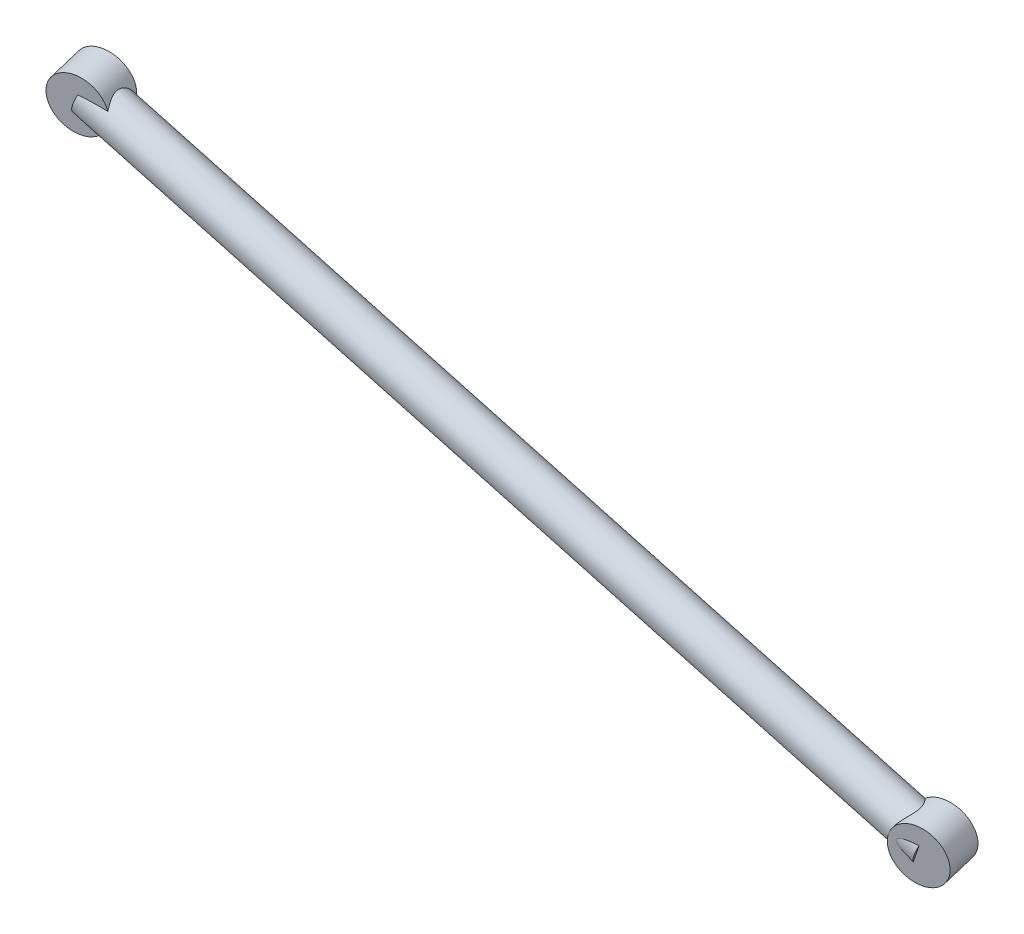
ISO-10303-21;
HEADER;
FILE_DESCRIPTION(('STEP AP214'),'2;1');
FILE_NAME('part.step','',(''),(''),'','','');
FILE_SCHEMA(('AUTOMOTIVE_DESIGN { 1 0 10303 214 1 1 1 1 }'));
ENDSEC;
DATA;
#1=APPLICATION_CONTEXT('core data for automotive mechanical design processes');
#2=APPLICATION_PROTOCOL_DEFINITION('international standard','automotive_design',2000,#1);
#3=PRODUCT_CONTEXT('',#1,'mechanical');
#4=PRODUCT('Part','Part','',(#3));
#5=PRODUCT_RELATED_PRODUCT_CATEGORY('part','',(#4));
#6=PRODUCT_DEFINITION_FORMATION('','',#4);
#7=PRODUCT_DEFINITION_CONTEXT('part definition',#1,'design');
#8=PRODUCT_DEFINITION('design','',#6,#7);
#9=PRODUCT_DEFINITION_SHAPE('','',#8);
#10=(LENGTH_UNIT() NAMED_UNIT(*) SI_UNIT(.MILLI.,.METRE.));
#11=(NAMED_UNIT(*) PLANE_ANGLE_UNIT() SI_UNIT($,.RADIAN.));
#12=(NAMED_UNIT(*) SI_UNIT($,.STERADIAN.) SOLID_ANGLE_UNIT());
#13=UNCERTAINTY_MEASURE_WITH_UNIT(LENGTH_MEASURE(1.E-05),#10,'distance_accuracy_value','');
#14=(GEOMETRIC_REPRESENTATION_CONTEXT(3) GLOBAL_UNCERTAINTY_ASSIGNED_CONTEXT((#13)) GLOBAL_UNIT_ASSIGNED_CONTEXT((#10,
#11,#12)) REPRESENTATION_CONTEXT('',''));
#15=CARTESIAN_POINT('',(0.,0.,0.));
#16=DIRECTION('',(0.,0.,1.));
#17=DIRECTION('',(1.,0.,0.));
#18=AXIS2_PLACEMENT_3D('',#15,#16,#17);
#19=CARTESIAN_POINT('',(270.,-90.4,-82.3915));
#20=DIRECTION('',(0.939705089189174,-0.336195624096405,-0.0626645648703886));
#21=DIRECTION('',(0.336857669052995,0.941555580303246,0.));
#22=AXIS2_PLACEMENT_3D('',#19,#20,#21);
#23=PLANE('',#22);
#24=DIRECTION('',(0.338112197345584,0.940832147772697,0.0226938697351189));
#25=VECTOR('',#24,1.);
#26=CARTESIAN_POINT('',(270.362363465706,-90.7001374074665,-75.3473327454949));
#27=LINE('',#26,#25);
#28=CARTESIAN_POINT('',(269.090130430052,-94.2402573700075,-75.4327241954648));
#29=VERTEX_POINT('',#28);
#30=CARTESIAN_POINT('',(271.63459650136,-87.1600174449255,-75.261941295525));
#31=VERTEX_POINT('',#30);
#32=EDGE_CURVE('E214',#29,#31,#27,.T.);
#33=ORIENTED_EDGE('',*,*,#32,.F.);
#34=CARTESIAN_POINT('',(270.,-90.4,-82.3915));
#35=DIRECTION('',(0.939705089189174,-0.336195624096405,-0.0626645648703886));
#36=DIRECTION('',(0.336857669052995,0.941555580303246,0.));
#37=AXIS2_PLACEMENT_3D('',#34,#35,#36);
#38=CIRCLE('',#37,8.);
#39=EDGE_CURVE('E121',#31,#29,#38,.T.);
#40=ORIENTED_EDGE('',*,*,#39,.F.);
#41=EDGE_LOOP('',(#33,#40));
#42=FACE_BOUND('',#41,.T.);
#43=ADVANCED_FACE('F61',(#42),#23,.F.);
#44=CARTESIAN_POINT('',(270.,-90.4,-82.3915));
#45=DIRECTION('',(0.939705089189174,-0.336195624096405,-0.0626645648703886));
#46=DIRECTION('',(0.336857669052995,0.941555580303246,0.));
#47=AXIS2_PLACEMENT_3D('',#44,#45,#46);
#48=CYLINDRICAL_SURFACE('',#47,8.);
#49=CARTESIAN_POINT('',(539.674755458417,-186.880772273583,-100.374856056858));
#50=DIRECTION('',(-0.173007213039323,0.0858414993815809,-0.981172635788569));
#51=DIRECTION('',(0.925066833594974,-0.327820234026552,-0.191794805835157));
#52=AXIS2_PLACEMENT_3D('',#49,#50,#51);
#53=ELLIPSE('',#52,61.5618840675635,8.);
#54=CARTESIAN_POINT('',(578.431216688687,-206.55758171269,-108.930164127866));
#55=VERTEX_POINT('',#54);
#56=CARTESIAN_POINT('',(588.658920356653,-208.230485995303,-110.879944471863));
#57=VERTEX_POINT('',#56);
#58=EDGE_CURVE('E82',#55,#57,#53,.F.);
#59=ORIENTED_EDGE('',*,*,#58,.F.);
#60=CARTESIAN_POINT('',(582.219895823248,-196.015189276846,-108.675870493402));
#61=CARTESIAN_POINT('',(582.312938212273,-195.958229081088,-108.592740020389));
#62=CARTESIAN_POINT('',(582.405871129967,-195.903573753323,-108.507939936008));
#63=CARTESIAN_POINT('',(582.5911989951,-195.798752866117,-108.335052034581));
#64=CARTESIAN_POINT('',(582.683593972178,-195.748587057092,-108.246964400687));
#65=CARTESIAN_POINT('',(582.95963091215,-195.604571281708,-107.977714369389));
#66=CARTESIAN_POINT('',(583.142000765766,-195.517278119883,-107.791675115296));
#67=CARTESIAN_POINT('',(583.502615819055,-195.358436963599,-107.404501682822));
#68=CARTESIAN_POINT('',(583.680782284713,-195.287096692628,-107.203209482815));
#69=CARTESIAN_POINT('',(584.027229319422,-195.160893711058,-106.787454435563));
#70=CARTESIAN_POINT('',(584.195514367379,-195.106023488049,-106.572997646956));
#71=CARTESIAN_POINT('',(584.472790097206,-195.025490740036,-106.192755295035));
#72=CARTESIAN_POINT('',(584.585150289241,-194.995953656575,-106.030235495513));
#73=CARTESIAN_POINT('',(584.800901333658,-194.945088021334,-105.698027771693));
#74=CARTESIAN_POINT('',(584.904290829179,-194.92376070965,-105.528338768771));
#75=CARTESIAN_POINT('',(585.099590639921,-194.889409205271,-105.182581379614));
#76=CARTESIAN_POINT('',(585.191547321102,-194.87635053315,-105.006542763329));
#77=CARTESIAN_POINT('',(585.362186790941,-194.858486600579,-104.647756671015));
#78=CARTESIAN_POINT('',(585.440874741672,-194.853678123758,-104.465011837824));
#79=CARTESIAN_POINT('',(585.569151089357,-194.852562618579,-104.128947177558));
#80=CARTESIAN_POINT('',(585.621427268753,-194.854809985319,-103.976657238894));
#81=CARTESIAN_POINT('',(585.714616226058,-194.864875716758,-103.668873565959));
#82=CARTESIAN_POINT('',(585.755534575847,-194.872691343066,-103.513381442964));
#83=CARTESIAN_POINT('',(585.825107591947,-194.893954514975,-103.200116163547));
#84=CARTESIAN_POINT('',(585.853767715389,-194.907399549182,-103.042344054538));
#85=CARTESIAN_POINT('',(585.898303615651,-194.939960737657,-102.72557630832));
#86=CARTESIAN_POINT('',(585.914179187899,-194.959076982666,-102.566580651573));
#87=CARTESIAN_POINT('',(585.933053729678,-195.00298356718,-102.248606905272));
#88=CARTESIAN_POINT('',(585.936052248386,-195.02777410531,-102.089628816529));
#89=CARTESIAN_POINT('',(585.929549569115,-195.082997771528,-101.772927016967));
#90=CARTESIAN_POINT('',(585.920048386494,-195.113430892684,-101.615203304607));
#91=CARTESIAN_POINT('',(585.889302047749,-195.179929628223,-101.301928525686));
#92=CARTESIAN_POINT('',(585.868043244819,-195.216001752705,-101.146380199551));
#93=CARTESIAN_POINT('',(585.814809595704,-195.293720760354,-100.838475410715));
#94=CARTESIAN_POINT('',(585.782828522169,-195.335370874681,-100.686120857679));
#95=CARTESIAN_POINT('',(585.697579783711,-195.438408522246,-100.337277569089));
#96=CARTESIAN_POINT('',(585.640775463248,-195.501848661658,-100.142254619789));
#97=CARTESIAN_POINT('',(585.513372715139,-195.638312275512,-99.7603286081492));
#98=CARTESIAN_POINT('',(585.442775321292,-195.711335031598,-99.5734249385473));
#99=CARTESIAN_POINT('',(585.290285543463,-195.867127738977,-99.2081863052255));
#100=CARTESIAN_POINT('',(585.208377921753,-195.949910817515,-99.0298633464632));
#101=CARTESIAN_POINT('',(585.035677651023,-196.125242414216,-98.6826148994876));
#102=CARTESIAN_POINT('',(584.9448856402,-196.21779023098,-98.5136887376341));
#103=CARTESIAN_POINT('',(584.754267429134,-196.415055121055,-98.1818845878169));
#104=CARTESIAN_POINT('',(584.65428085215,-196.520004139152,-98.0192368386471));
#105=CARTESIAN_POINT('',(584.449012553911,-196.740474982854,-97.7047035026364));
#106=CARTESIAN_POINT('',(584.343728894031,-196.85600069218,-97.5528219057028));
#107=CARTESIAN_POINT('',(584.129608362266,-197.097728747517,-97.2604663548639));
#108=CARTESIAN_POINT('',(584.020771347869,-197.223931522069,-97.1199928592844));
#109=CARTESIAN_POINT('',(583.801169069469,-197.487018240378,-96.8512050286951));
#110=CARTESIAN_POINT('',(583.690404540479,-197.6238981791,-96.7228861740573));
#111=CARTESIAN_POINT('',(583.452481253875,-197.928734516413,-96.4616699398538));
#112=CARTESIAN_POINT('',(583.325246126574,-198.098334213676,-96.3307480844998));
#113=CARTESIAN_POINT('',(583.072281594171,-198.451228407314,-96.0870741653783));
#114=CARTESIAN_POINT('',(582.946552352745,-198.634524376959,-95.9743240604267));
#115=CARTESIAN_POINT('',(582.698788988912,-199.014048495074,-95.7684980136202));
#116=CARTESIAN_POINT('',(582.576752730617,-199.210268951479,-95.6754105058231));
#117=CARTESIAN_POINT('',(582.338378104367,-199.614656826735,-95.5102710225816));
#118=CARTESIAN_POINT('',(582.222038664408,-199.822821981749,-95.4382150767523));
#119=CARTESIAN_POINT('',(582.009578255799,-200.225752264815,-95.3232141699016));
#120=CARTESIAN_POINT('',(581.912649466941,-200.419422506472,-95.2779187456579));
#121=CARTESIAN_POINT('',(581.72610806689,-200.813595372121,-95.2056655397416));
#122=CARTESIAN_POINT('',(581.636494939529,-201.01409751266,-95.1787064633355));
#123=CARTESIAN_POINT('',(581.465753805224,-201.420136570169,-95.1436196900764));
#124=CARTESIAN_POINT('',(581.384620025657,-201.625669942735,-95.1354791010663));
#125=CARTESIAN_POINT('',(581.231655569589,-202.040039901745,-95.138172265982));
#126=CARTESIAN_POINT('',(581.159824135269,-202.248876217556,-95.1490044732391));
#127=CARTESIAN_POINT('',(581.033796943519,-202.643674258513,-95.1871477693689));
#128=CARTESIAN_POINT('',(580.978522590393,-202.829493901602,-95.2124124141944));
#129=CARTESIAN_POINT('',(580.875945642034,-203.200815824591,-95.2773561266349));
#130=CARTESIAN_POINT('',(580.828643106875,-203.386318102089,-95.3170353028697));
#131=CARTESIAN_POINT('',(580.742055605775,-203.755658533237,-95.4103345116842));
#132=CARTESIAN_POINT('',(580.702770258451,-203.939496765648,-95.4639538808437));
#133=CARTESIAN_POINT('',(580.632072815774,-204.304284570454,-95.5845368074432));
#134=CARTESIAN_POINT('',(580.600661081093,-204.485234010164,-95.6515009759255));
#135=CARTESIAN_POINT('',(580.544869480882,-204.846627657174,-95.7995323984159));
#136=CARTESIAN_POINT('',(580.520640183972,-205.026991824961,-95.8808512873924));
#137=CARTESIAN_POINT('',(580.479584521276,-205.382516512537,-96.0559120777981));
#138=CARTESIAN_POINT('',(580.462760661693,-205.557675251995,-96.1496581709868));
#139=CARTESIAN_POINT('',(580.435929751584,-205.901803322677,-96.3487961887398));
#140=CARTESIAN_POINT('',(580.425923635051,-206.070771802873,-96.4541897066364));
#141=CARTESIAN_POINT('',(580.412026146859,-206.4016656808,-96.6758818565663));
#142=CARTESIAN_POINT('',(580.408135419958,-206.563590334138,-96.7921816370963));
#143=CARTESIAN_POINT('',(580.405516473486,-206.899594620366,-97.0503462797077));
#144=CARTESIAN_POINT('',(580.407502500048,-207.072625717088,-97.1935847355845));
#145=CARTESIAN_POINT('',(580.416941328031,-207.407689786963,-97.4921103205187));
#146=CARTESIAN_POINT('',(580.424392513829,-207.569725994985,-97.6473938766476));
#147=CARTESIAN_POINT('',(580.443338979035,-207.882027197718,-97.9694954691185));
#148=CARTESIAN_POINT('',(580.454838919765,-208.032278379509,-98.136326621561));
#149=CARTESIAN_POINT('',(580.480266689778,-208.319653010937,-98.4806607945616));
#150=CARTESIAN_POINT('',(580.494193530605,-208.456781770132,-98.6581594511301));
#151=CARTESIAN_POINT('',(580.521542979064,-208.706538001085,-99.0089893054974));
#152=CARTESIAN_POINT('',(580.534919543357,-208.820243455473,-99.1815566055426));
#153=CARTESIAN_POINT('',(580.560588386851,-209.034368191296,-99.5348638995202));
#154=CARTESIAN_POINT('',(580.572880622827,-209.134786943143,-99.7156042188332));
#155=CARTESIAN_POINT('',(580.594578035505,-209.320853946624,-100.084395809616));
#156=CARTESIAN_POINT('',(580.603987450342,-209.406523799092,-100.272435886422));
#157=CARTESIAN_POINT('',(580.618008668117,-209.561735667765,-100.655236009708));
#158=CARTESIAN_POINT('',(580.62262185282,-209.631282324474,-100.849994104053));
#159=CARTESIAN_POINT('',(580.624818347279,-209.739661104366,-101.202750737794));
#160=CARTESIAN_POINT('',(580.623694092802,-209.781881047891,-101.359703054717));
#161=CARTESIAN_POINT('',(580.616370135605,-209.854611398264,-101.676170181587));
#162=CARTESIAN_POINT('',(580.610171661346,-209.885124636661,-101.835684362148));
#163=CARTESIAN_POINT('',(580.591967945314,-209.933793918053,-102.156067795255));
#164=CARTESIAN_POINT('',(580.579970038621,-209.951965501047,-102.316935084536));
#165=CARTESIAN_POINT('',(580.549679555263,-209.975616303169,-102.639021138542));
#166=CARTESIAN_POINT('',(580.531386945535,-209.98109545563,-102.800239905108));
#167=CARTESIAN_POINT('',(580.488306275497,-209.979270735202,-103.122023124824));
#168=CARTESIAN_POINT('',(580.463506864911,-209.97194439709,-103.282585931746));
#169=CARTESIAN_POINT('',(580.407623249564,-209.944719294511,-103.601524871279));
#170=CARTESIAN_POINT('',(580.376539089015,-209.924820618486,-103.759901019263));
#171=CARTESIAN_POINT('',(580.308574892357,-209.872986607863,-104.073530524057));
#172=CARTESIAN_POINT('',(580.271690094391,-209.841041353608,-104.228781195935));
#173=CARTESIAN_POINT('',(580.192884497655,-209.765873905756,-104.535278135093));
#174=CARTESIAN_POINT('',(580.150961114171,-209.72264591086,-104.686522298132));
#175=CARTESIAN_POINT('',(580.048841140733,-209.610225242431,-105.032259158272));
#176=CARTESIAN_POINT('',(579.987100666224,-209.537152575829,-105.22503790653));
#177=CARTESIAN_POINT('',(579.858552567262,-209.37485711774,-105.601932580921));
#178=CARTESIAN_POINT('',(579.791742564882,-209.285626719716,-105.786044375276));
#179=CARTESIAN_POINT('',(579.654887679089,-209.092471768214,-106.146097261597));
#180=CARTESIAN_POINT('',(579.584831363211,-208.988492127188,-106.322004278451));
#181=CARTESIAN_POINT('',(579.443642842106,-208.76764107103,-106.664955019413));
#182=CARTESIAN_POINT('',(579.372510918496,-208.650772981621,-106.832001013612));
#183=CARTESIAN_POINT('',(579.221765400618,-208.389586282833,-107.17834397328));
#184=CARTESIAN_POINT('',(579.142232359626,-208.2436689726,-107.356469730064));
#185=CARTESIAN_POINT('',(578.986086664865,-207.938215592937,-107.702012437659));
#186=CARTESIAN_POINT('',(578.909474379535,-207.778677813526,-107.869428039234));
#187=CARTESIAN_POINT('',(578.761950265046,-207.448770116211,-108.191874531115));
#188=CARTESIAN_POINT('',(578.690986203168,-207.278534399874,-108.347018790317));
#189=CARTESIAN_POINT('',(578.555686403222,-206.926528211785,-108.646633663215));
#190=CARTESIAN_POINT('',(578.491348804095,-206.744761001987,-108.791107270551));
#191=CARTESIAN_POINT('',(578.431216688687,-206.55758171269,-108.930164127866));
#192=B_SPLINE_CURVE_WITH_KNOTS('',3,(#60,#61,#62,#63,#64,#65,#66,#67,#68,#69,#70,#71,#72,#73,
#74,#75,#76,#77,#78,#79,#80,#81,#82,#83,#84,#85,#86,#87,#88,#89,#90,#91,#92,#93,#94,#95,#96,#97,
#98,#99,#100,#101,#102,#103,#104,#105,#106,#107,#108,#109,#110,#111,#112,#113,#114,#115,#116,
#117,#118,#119,#120,#121,#122,#123,#124,#125,#126,#127,#128,#129,#130,#131,#132,#133,#134,#135,
#136,#137,#138,#139,#140,#141,#142,#143,#144,#145,#146,#147,#148,#149,#150,#151,#152,#153,#154,
#155,#156,#157,#158,#159,#160,#161,#162,#163,#164,#165,#166,#167,#168,#169,#170,#171,#172,#173,
#174,#175,#176,#177,#178,#179,#180,#181,#182,#183,#184,#185,#186,#187,#188,#189,#190,#191),
.UNSPECIFIED.,.F.,.F.,(4,2,2,2,2,2,2,2,2,2,2,2,2,2,2,2,2,2,2,2,2,2,2,2,2,2,2,2,2,2,2,2,2,2,2,2,
2,2,2,2,2,2,2,2,2,2,2,2,2,2,2,2,2,2,2,2,2,2,2,2,2,2,2,2,2,4),(0.,0.411404754147778,
0.822786622924005,1.64609549134124,2.47957022362883,3.31266420697654,3.91155846089786,
4.51054314297086,5.10701337665049,5.70325102115946,6.18585355812874,6.66821892172143,
7.15036932120195,7.63252743561477,8.11470243019793,8.59687683238335,9.07961206161175,
9.56262814406022,10.2000972470198,10.8375185896628,11.4758072340743,12.1140500615438,
12.7670540440495,13.4202987763834,14.073569740153,14.7265968276383,15.4731339788758,
16.219751549013,16.9659287128077,17.7119649203763,18.3747948663875,19.0375780049734,
19.6999069497808,20.3621819038205,20.9480119431507,21.5338463970563,22.1196529759333,
22.7054863843596,23.3028500992062,23.9004158230359,24.4980633934597,25.0957739706791,
25.7689907404149,26.4420085724803,27.115803796018,27.7893252273082,28.4100533842666,
29.0308062751766,29.6506421481054,30.2702994006144,30.7574348187236,31.2444523370212,
31.7308554845112,32.2172611868678,32.7045210683823,33.1917775222258,33.6794360827001,
34.1673458804866,34.8119868061906,35.4569320007285,36.104352760357,36.7516068492651,
37.4817614399473,38.2120078331038,38.9344389391204,39.656666591918),.UNSPECIFIED.);
#193=CARTESIAN_POINT('',(582.219895823248,-196.015189276846,-108.675870493402));
#194=VERTEX_POINT('',#193);
#195=EDGE_CURVE('E12',#194,#55,#192,.T.);
#196=ORIENTED_EDGE('',*,*,#195,.F.);
#197=CARTESIAN_POINT('',(591.203386681192,-201.150245350511,-110.709161635756));
#198=VERTEX_POINT('',#197);
#199=EDGE_CURVE('E123',#198,#194,#53,.F.);
#200=ORIENTED_EDGE('',*,*,#199,.F.);
#201=CARTESIAN_POINT('',(590.293517,-204.990503,-103.750386));
#202=DIRECTION('',(0.939705089189174,-0.336195624096405,-0.0626645648703886));
#203=DIRECTION('',(0.336857669052995,0.941555580303246,0.));
#204=AXIS2_PLACEMENT_3D('',#201,#202,#203);
#205=CIRCLE('',#204,8.);
#206=EDGE_CURVE('E116',#57,#198,#205,.T.);
#207=ORIENTED_EDGE('',*,*,#206,.F.);
#208=EDGE_LOOP('',(#59,#196,#200,#207));
#209=FACE_BOUND('',#208,.T.);
#210=CARTESIAN_POINT('',(281.862299710489,-88.8329222290246,-77.2117208335654));
#211=CARTESIAN_POINT('',(281.828045104761,-88.7262993527284,-77.290905500751));
#212=CARTESIAN_POINT('',(281.79243417379,-88.6214503369471,-77.3718581629791));
#213=CARTESIAN_POINT('',(281.718821281508,-88.4154127801675,-77.5372478133217));
#214=CARTESIAN_POINT('',(281.680819453315,-88.3142240358705,-77.6216846073614));
#215=CARTESIAN_POINT('',(281.563652299669,-88.0161682216041,-77.8802713812324));
#216=CARTESIAN_POINT('',(281.481371539225,-87.8249531369923,-78.0595927076238));
#217=CARTESIAN_POINT('',(281.310205966511,-87.4566315203745,-78.4340503888914));
#218=CARTESIAN_POINT('',(281.221252154996,-87.2797283477633,-78.6293546811197));
#219=CARTESIAN_POINT('',(281.040688984708,-86.944342290849,-79.0339756871686));
#220=CARTESIAN_POINT('',(280.949080857608,-86.7858510286931,-79.2432859590671));
#221=CARTESIAN_POINT('',(280.792272658938,-86.5311703333479,-79.6154426025155));
#222=CARTESIAN_POINT('',(280.72688841241,-86.4299919390099,-79.7748094131456));
#223=CARTESIAN_POINT('',(280.59792613274,-86.2393587528794,-80.1011919454477));
#224=CARTESIAN_POINT('',(280.534348373811,-86.1499057335635,-80.2682088184104));
#225=CARTESIAN_POINT('',(280.410862779353,-85.9844266370735,-80.6091461023316));
#226=CARTESIAN_POINT('',(280.3509406584,-85.9083457719508,-80.7830345901139));
#227=CARTESIAN_POINT('',(280.236187391115,-85.770700444218,-81.1380696603432));
#228=CARTESIAN_POINT('',(280.181354268707,-85.7091303326102,-81.3192133861078));
#229=CARTESIAN_POINT('',(280.088273973681,-85.6123090938421,-81.6529157169971));
#230=CARTESIAN_POINT('',(280.048857460553,-85.5742783463254,-81.8043425156752));
#231=CARTESIAN_POINT('',(279.975294531116,-85.5096011002675,-82.1108088886683));
#232=CARTESIAN_POINT('',(279.941145534356,-85.4829490161601,-82.2658466509242));
#233=CARTESIAN_POINT('',(279.87875916015,-85.4416882025903,-82.5786295568607));
#234=CARTESIAN_POINT('',(279.850519154989,-85.4270741113328,-82.7363734632135));
#235=CARTESIAN_POINT('',(279.80031121471,-85.4102958922871,-83.0535219059548));
#236=CARTESIAN_POINT('',(279.778343379958,-85.4081319637151,-83.2129264688748));
#237=CARTESIAN_POINT('',(279.740730005287,-85.4163680540534,-83.5321579514975));
#238=CARTESIAN_POINT('',(279.725084686775,-85.426768512901,-83.6919848857939));
#239=CARTESIAN_POINT('',(279.699826693728,-85.4599221443267,-84.0108184441598));
#240=CARTESIAN_POINT('',(279.690214011782,-85.4826753017284,-84.1698250692368));
#241=CARTESIAN_POINT('',(279.676430673749,-85.5400849506958,-84.4860886579394));
#242=CARTESIAN_POINT('',(279.672266360402,-85.5747552564971,-84.643343371385));
#243=CARTESIAN_POINT('',(279.668607945616,-85.6553442673608,-84.9550667284652));
#244=CARTESIAN_POINT('',(279.669116562695,-85.7012695049573,-85.109533697948));
#245=CARTESIAN_POINT('',(279.674673505472,-85.819982490653,-85.4637258416812));
#246=CARTESIAN_POINT('',(279.681121476672,-85.8966640828705,-85.6621286653815));
#247=CARTESIAN_POINT('',(279.698435990763,-86.066532335597,-86.0514437086298));
#248=CARTESIAN_POINT('',(279.709302202572,-86.159717759086,-86.2423564882737));
#249=CARTESIAN_POINT('',(279.733414340787,-86.3611490940615,-86.6162117321863));
#250=CARTESIAN_POINT('',(279.746663485015,-86.4694153249511,-86.7991429982698));
#251=CARTESIAN_POINT('',(279.773658212924,-86.6995244679477,-87.1561710996878));
#252=CARTESIAN_POINT('',(279.787403760903,-86.8213664049508,-87.330268568223));
#253=CARTESIAN_POINT('',(279.814028412364,-87.0804305701829,-87.673079860913));
#254=CARTESIAN_POINT('',(279.826880124443,-87.2179433381967,-87.8415760491297));
#255=CARTESIAN_POINT('',(279.849776293959,-87.5049418386142,-88.1683500949322));
#256=CARTESIAN_POINT('',(279.859819714669,-87.6544319665242,-88.3266241623165));
#257=CARTESIAN_POINT('',(279.875679680956,-87.9643844922418,-88.6322868529856));
#258=CARTESIAN_POINT('',(279.881496056783,-88.124847330411,-88.7796750388991));
#259=CARTESIAN_POINT('',(279.887634085306,-88.4557470368163,-89.0627904802878));
#260=CARTESIAN_POINT('',(279.887957788457,-88.6261801592297,-89.1985220684283));
#261=CARTESIAN_POINT('',(279.881550053983,-89.0012202863843,-89.4761377074226));
#262=CARTESIAN_POINT('',(279.873801718376,-89.2072261225142,-89.6161196117273));
#263=CARTESIAN_POINT('',(279.848151939562,-89.6296052476454,-89.8784940376899));
#264=CARTESIAN_POINT('',(279.830249402726,-89.8459796510657,-90.0008846629481));
#265=CARTESIAN_POINT('',(279.783064509825,-90.2871797577815,-90.2265075442651));
#266=CARTESIAN_POINT('',(279.753788872583,-90.512000400638,-90.3297510586508));
#267=CARTESIAN_POINT('',(279.682918835897,-90.9681179876214,-90.5156469448578));
#268=CARTESIAN_POINT('',(279.641326764568,-91.199413700323,-90.5983032027546));
#269=CARTESIAN_POINT('',(279.550625426808,-91.6400625303074,-90.7336522294075));
#270=CARTESIAN_POINT('',(279.502871932816,-91.8489857991582,-90.7886586823949));
#271=CARTESIAN_POINT('',(279.39709326554,-92.2682239388901,-90.8805323149099));
#272=CARTESIAN_POINT('',(279.339068817855,-92.4785387104579,-90.9174007751133));
#273=CARTESIAN_POINT('',(279.21298265096,-92.8984524909989,-90.9724104920843));
#274=CARTESIAN_POINT('',(279.144927837377,-93.1080518917058,-90.990564564982));
#275=CARTESIAN_POINT('',(278.999249428606,-93.5246867480238,-91.0079161959359));
#276=CARTESIAN_POINT('',(278.921626613886,-93.7317224112465,-91.0071152991436));
#277=CARTESIAN_POINT('',(278.767077763585,-94.117656356542,-90.9878041537886));
#278=CARTESIAN_POINT('',(278.691105514645,-94.2970440181306,-90.9713487283556));
#279=CARTESIAN_POINT('',(278.53299262154,-94.6511186560441,-90.9239024129045));
#280=CARTESIAN_POINT('',(278.450851930897,-94.8258055969367,-90.8929114133554));
#281=CARTESIAN_POINT('',(278.281230912125,-95.1693919743655,-90.8168088152753));
#282=CARTESIAN_POINT('',(278.193750838252,-95.3382916858858,-90.7716978886975));
#283=CARTESIAN_POINT('',(278.014350596729,-95.6694266443672,-90.6679014141083));
#284=CARTESIAN_POINT('',(277.922430225909,-95.8316615857461,-90.6092152444834));
#285=CARTESIAN_POINT('',(277.733270392696,-96.1518707224489,-90.477624863983));
#286=CARTESIAN_POINT('',(277.6359618485,-96.3096982131443,-90.4044635499154));
#287=CARTESIAN_POINT('',(277.43875441688,-96.6171653135305,-90.2453948917197));
#288=CARTESIAN_POINT('',(277.338854664614,-96.7668021362978,-90.1594832456656));
#289=CARTESIAN_POINT('',(277.137556008836,-97.0574682509903,-89.9756572045719));
#290=CARTESIAN_POINT('',(277.036156901865,-97.1984963611696,-89.8777411671757));
#291=CARTESIAN_POINT('',(276.83295556714,-97.4717024719905,-89.6706206177888));
#292=CARTESIAN_POINT('',(276.731153298013,-97.6038795380446,-89.5614149168025));
#293=CARTESIAN_POINT('',(276.515441116912,-97.8754042468147,-89.3179045936402));
#294=CARTESIAN_POINT('',(276.401626277003,-98.0135484131869,-89.1821720570582));
#295=CARTESIAN_POINT('',(276.176591994683,-98.2784010288043,-88.8981171836087));
#296=CARTESIAN_POINT('',(276.065371795263,-98.4051128452758,-88.7497985789182));
#297=CARTESIAN_POINT('',(275.847123933858,-98.6473883986522,-88.4410740526275));
#298=CARTESIAN_POINT('',(275.740101262996,-98.7629390895279,-88.2806543670511));
#299=CARTESIAN_POINT('',(275.532371407542,-98.9828388402212,-87.9485562787854));
#300=CARTESIAN_POINT('',(275.431661674366,-99.0871924326646,-87.7768824774852));
#301=CARTESIAN_POINT('',(275.246283121756,-99.2771684076984,-87.4366594575862));
#302=CARTESIAN_POINT('',(275.160975717217,-99.3636178627061,-87.2689200853972));
#303=CARTESIAN_POINT('',(274.99952470618,-99.5273208555867,-86.924726349817));
#304=CARTESIAN_POINT('',(274.923381464966,-99.6045740268934,-86.7482716394267));
#305=CARTESIAN_POINT('',(274.78260694357,-99.7498511815849,-86.3874723629413));
#306=CARTESIAN_POINT('',(274.717958823323,-99.8178886303479,-86.2031398373448));
#307=CARTESIAN_POINT('',(274.602520894601,-99.9448790264157,-85.827146662472));
#308=CARTESIAN_POINT('',(274.551727097889,-100.003834585987,-85.6354881402777));
#309=CARTESIAN_POINT('',(274.475667212071,-100.10098814,-85.2876891164237));
#310=CARTESIAN_POINT('',(274.447264865219,-100.1409289355,-85.132718594972));
#311=CARTESIAN_POINT('',(274.40178561224,-100.215128808406,-84.8197955606376));
#312=CARTESIAN_POINT('',(274.384705966715,-100.249389258602,-84.6618437785549));
#313=CARTESIAN_POINT('',(274.362866806563,-100.312143245427,-84.3441479666351));
#314=CARTESIAN_POINT('',(274.358091777303,-100.340644002482,-84.1844064490748));
#315=CARTESIAN_POINT('',(274.361466839426,-100.391887966985,-83.8641269037131));
#316=CARTESIAN_POINT('',(274.369616998699,-100.41463114419,-83.7035888717326));
#317=CARTESIAN_POINT('',(274.399070428461,-100.454374899728,-83.3827202588602));
#318=CARTESIAN_POINT('',(274.420396772173,-100.471365323267,-83.222390537365));
#319=CARTESIAN_POINT('',(274.475929609991,-100.499566344106,-82.9034750903869));
#320=CARTESIAN_POINT('',(274.510136013489,-100.510776982063,-82.7448893526437));
#321=CARTESIAN_POINT('',(274.590725342165,-100.527480118812,-82.4304124022442));
#322=CARTESIAN_POINT('',(274.637118292664,-100.5329678911,-82.2745235212335));
#323=CARTESIAN_POINT('',(274.74102476412,-100.538289441653,-81.9663417708712));
#324=CARTESIAN_POINT('',(274.798544001982,-100.538120305573,-81.814050795529));
#325=CARTESIAN_POINT('',(274.943533063099,-100.531253128447,-81.4654365788303));
#326=CARTESIAN_POINT('',(275.034688581378,-100.522475264412,-81.2706835270426));
#327=CARTESIAN_POINT('',(275.231316086607,-100.495332476884,-80.8892194337375));
#328=CARTESIAN_POINT('',(275.33679481058,-100.476963030282,-80.7025122314136));
#329=CARTESIAN_POINT('',(275.559721529186,-100.430613955121,-80.3366822793143));
#330=CARTESIAN_POINT('',(275.677213912779,-100.402597709342,-80.1575913926509));
#331=CARTESIAN_POINT('',(275.921366519685,-100.336940309779,-79.8077297834955));
#332=CARTESIAN_POINT('',(276.048024375064,-100.299301635665,-79.6369569309495));
#333=CARTESIAN_POINT('',(276.325159049422,-100.208797574375,-79.2821306379462));
#334=CARTESIAN_POINT('',(276.476608831379,-100.154599384612,-79.0991777059808));
#335=CARTESIAN_POINT('',(276.78608451776,-100.033396759494,-78.7433432680237));
#336=CARTESIAN_POINT('',(276.944111246613,-99.9663907148509,-78.5704630312177));
#337=CARTESIAN_POINT('',(277.26284921559,-99.8198787158685,-78.236524497531));
#338=CARTESIAN_POINT('',(277.423513625194,-99.7405142137105,-78.0753594805174));
#339=CARTESIAN_POINT('',(277.747231988919,-99.5682267948266,-77.7630978380472));
#340=CARTESIAN_POINT('',(277.910285257342,-99.4753077027782,-77.6119983898664));
#341=CARTESIAN_POINT('',(278.073620946412,-99.3753126154453,-77.4660144763715));
#342=B_SPLINE_CURVE_WITH_KNOTS('',3,(#210,#211,#212,#213,#214,#215,#216,#217,#218,#219,#220,
#221,#222,#223,#224,#225,#226,#227,#228,#229,#230,#231,#232,#233,#234,#235,#236,#237,#238,#239,
#240,#241,#242,#243,#244,#245,#246,#247,#248,#249,#250,#251,#252,#253,#254,#255,#256,#257,#258,
#259,#260,#261,#262,#263,#264,#265,#266,#267,#268,#269,#270,#271,#272,#273,#274,#275,#276,#277,
#278,#279,#280,#281,#282,#283,#284,#285,#286,#287,#288,#289,#290,#291,#292,#293,#294,#295,#296,
#297,#298,#299,#300,#301,#302,#303,#304,#305,#306,#307,#308,#309,#310,#311,#312,#313,#314,#315,
#316,#317,#318,#319,#320,#321,#322,#323,#324,#325,#326,#327,#328,#329,#330,#331,#332,#333,#334,
#335,#336,#337,#338,#339,#340,#341),.UNSPECIFIED.,.F.,.F.,(4,2,2,2,2,2,2,2,2,2,2,2,2,2,2,2,2,2,
2,2,2,2,2,2,2,2,2,2,2,2,2,2,2,2,2,2,2,2,2,2,2,2,2,2,2,2,2,2,2,2,2,2,2,2,2,2,2,2,2,2,2,2,2,2,2,
4),(0.,0.41140477250623,0.822786659586808,1.64609556356209,2.47957032866602,3.31266434520403,
3.91155867577401,4.5105434345729,5.10701374540335,5.70325146694687,6.18585400041387,
6.6682193604721,7.15036975572152,7.63252786588519,8.11470285912477,8.59687725996753,
9.07961248795262,9.56262856917858,10.2000976052731,10.8375188810374,11.4758074584866,
12.1140502190204,12.7670541399297,13.4202988106064,14.0735697129794,14.7265967392117,
15.4731339363273,16.2197515524228,16.9659287625594,17.7119650164539,18.3747950317765,
19.0375782397009,19.6999072532082,20.3621822758484,20.9480123198235,21.5338467783218,
22.1196533617807,22.7054867747752,23.3028504438505,23.9004161218801,24.4980636460765,
25.0957741770752,25.7689908801305,26.4420086455929,27.1158038030713,27.789325168566,
28.410053489275,29.0308065440954,29.6506425812909,30.2702999978834,30.7574354677688,
31.2444530377796,31.730856236385,32.2172619898394,32.7045219270434,33.1917784365589,
33.6794370521785,34.1673469051668,34.8119877196819,35.4569328028474,36.1043534527623,
36.7516074322532,37.4817626629119,38.2120096969502,38.9344414303081,39.6566697091258),.UNSPECIFIED.);
#343=CARTESIAN_POINT('',(281.862299710489,-88.8329222290246,-77.2117208335654));
#344=VERTEX_POINT('',#343);
#345=CARTESIAN_POINT('',(278.073620946412,-99.3753126154452,-77.4660144763714));
#346=VERTEX_POINT('',#345);
#347=EDGE_CURVE('E141',#344,#346,#342,.T.);
#348=ORIENTED_EDGE('',*,*,#347,.F.);
#349=CARTESIAN_POINT('',(320.618790794345,-108.509741192095,-85.7670318938731));
#350=DIRECTION('',(-0.17300714396088,0.0858414862619328,-0.981172649116781));
#351=DIRECTION('',(0.925066846311466,-0.327820238779969,-0.191794736376168));
#352=AXIS2_PLACEMENT_3D('',#349,#350,#351);
#353=ELLIPSE('',#352,61.5619173043896,8.);
#354=EDGE_CURVE('E136',#344,#31,#353,.F.);
#355=ORIENTED_EDGE('',*,*,#354,.T.);
#356=ORIENTED_EDGE('',*,*,#39,.T.);
#357=EDGE_CURVE('E139',#29,#346,#353,.F.);
#358=ORIENTED_EDGE('',*,*,#357,.T.);
#359=EDGE_LOOP('',(#348,#355,#356,#358));
#360=FACE_BOUND('',#359,.T.);
#361=ADVANCED_FACE('F124',(#209,#360),#48,.T.);
#362=CARTESIAN_POINT('',(590.293517,-204.990503,-103.750386));
#363=DIRECTION('',(0.939705089189174,-0.336195624096405,-0.0626645648703886));
#364=DIRECTION('',(0.336857669052995,0.941555580303246,0.));
#365=AXIS2_PLACEMENT_3D('',#362,#363,#364);
#366=PLANE('',#365);
#367=DIRECTION('',(0.338112196791146,0.940832148231925,0.0226938589571316));
#368=VECTOR('',#367,1.);
#369=CARTESIAN_POINT('',(589.931153518923,-204.690365672907,-110.794553053809));
#370=LINE('',#369,#368);
#371=EDGE_CURVE('E119',#57,#198,#370,.T.);
#372=ORIENTED_EDGE('',*,*,#371,.F.);
#373=ORIENTED_EDGE('',*,*,#206,.T.);
#374=EDGE_LOOP('',(#372,#373));
#375=FACE_BOUND('',#374,.T.);
#376=ADVANCED_FACE('F117',(#375),#366,.T.);
#377=CARTESIAN_POINT('',(268.78895,-89.7991096,-89.2597085));
#378=DIRECTION('',(-0.17300714396088,0.0858414862619328,-0.981172649116781));
#379=DIRECTION('',(-0.984807764479994,0.,0.173648112629874));
#380=AXIS2_PLACEMENT_3D('',#377,#378,#379);
#381=PLANE('',#380);
#382=CARTESIAN_POINT('',(268.78895,-89.7991096,-89.2597085));
#383=DIRECTION('',(-0.17300714396088,0.0858414862619328,-0.981172649116781));
#384=DIRECTION('',(-0.984807764479994,0.,0.173648112629874));
#385=AXIS2_PLACEMENT_3D('',#382,#383,#384);
#386=CIRCLE('',#385,11.);
#387=CARTESIAN_POINT('',(257.95606459072,-89.7991096,-87.3495792610714));
#388=VERTEX_POINT('',#387);
#389=EDGE_CURVE('E208',#388,#388,#386,.T.);
#390=ORIENTED_EDGE('',*,*,#389,.T.);
#391=EDGE_LOOP('',(#390));
#392=FACE_BOUND('',#391,.T.);
#393=DIRECTION('',(0.338112197345584,0.940832147772697,0.0226938697351189));
#394=VECTOR('',#393,1.);
#395=CARTESIAN_POINT('',(269.637636534294,-90.0998625925335,-89.4356672545051));
#396=LINE('',#395,#394);
#397=CARTESIAN_POINT('',(268.36540349864,-93.6399825550745,-89.5210587044751));
#398=VERTEX_POINT('',#397);
#399=CARTESIAN_POINT('',(270.909869569948,-86.5597426299925,-89.3502758045352));
#400=VERTEX_POINT('',#399);
#401=EDGE_CURVE('E211',#398,#400,#396,.T.);
#402=ORIENTED_EDGE('',*,*,#401,.F.);
#403=CARTESIAN_POINT('',(219.381209205655,-72.2902588079052,-79.0159681061269));
#404=DIRECTION('',(-0.17300714396088,0.0858414862619328,-0.981172649116781));
#405=DIRECTION('',(0.925066846311466,-0.327820238779969,-0.191794736376168));
#406=AXIS2_PLACEMENT_3D('',#403,#404,#405);
#407=ELLIPSE('',#406,61.5619173043896,8.);
#408=EDGE_CURVE('E132',#398,#400,#407,.F.);
#409=ORIENTED_EDGE('',*,*,#408,.T.);
#410=EDGE_LOOP('',(#402,#409));
#411=FACE_BOUND('',#410,.T.);
#412=ADVANCED_FACE('F159',(#392,#411),#381,.T.);
#413=CARTESIAN_POINT('',(271.21105,-91.0008904,-75.5232915));
#414=DIRECTION('',(-0.17300714396088,0.0858414862619328,-0.981172649116781));
#415=DIRECTION('',(-0.984807764479994,0.,0.173648112629874));
#416=AXIS2_PLACEMENT_3D('',#413,#414,#415);
#417=PLANE('',#416);
#418=ORIENTED_EDGE('',*,*,#354,.F.);
#419=CARTESIAN_POINT('',(271.21105,-91.0008904,-75.5232915));
#420=DIRECTION('',(-0.17300714396088,0.0858414862619328,-0.981172649116781));
#421=DIRECTION('',(-0.984807764479994,0.,0.173648112629874));
#422=AXIS2_PLACEMENT_3D('',#419,#420,#421);
#423=CIRCLE('',#422,11.);
#424=EDGE_CURVE('E205',#346,#344,#423,.T.);
#425=ORIENTED_EDGE('',*,*,#424,.F.);
#426=ORIENTED_EDGE('',*,*,#357,.F.);
#427=ORIENTED_EDGE('',*,*,#32,.T.);
#428=EDGE_LOOP('',(#418,#425,#426,#427));
#429=FACE_BOUND('',#428,.T.);
#430=ADVANCED_FACE('F157',(#429),#417,.F.);
#431=CARTESIAN_POINT('',(271.21105,-91.0008904,-75.5232915));
#432=DIRECTION('',(-0.173007143960884,0.0858414862619337,-0.98117264911678));
#433=DIRECTION('',(-0.984807764479993,0.,0.173648112629878));
#434=AXIS2_PLACEMENT_3D('',#431,#432,#433);
#435=CYLINDRICAL_SURFACE('',#434,11.);
#436=ORIENTED_EDGE('',*,*,#389,.F.);
#437=EDGE_LOOP('',(#436));
#438=FACE_BOUND('',#437,.T.);
#439=ORIENTED_EDGE('',*,*,#424,.T.);
#440=ORIENTED_EDGE('',*,*,#347,.T.);
#441=EDGE_LOOP('',(#439,#440));
#442=FACE_BOUND('',#441,.T.);
#443=ADVANCED_FACE('F152',(#438,#442),#435,.T.);
#444=ORIENTED_EDGE('',*,*,#408,.F.);
#445=EDGE_CURVE('E216',#398,#400,#38,.T.);
#446=ORIENTED_EDGE('',*,*,#445,.T.);
#447=EDGE_LOOP('',(#444,#446));
#448=FACE_BOUND('',#447,.T.);
#449=ADVANCED_FACE('F149',(#448),#48,.T.);
#450=ORIENTED_EDGE('',*,*,#445,.F.);
#451=ORIENTED_EDGE('',*,*,#401,.T.);
#452=EDGE_LOOP('',(#450,#451));
#453=FACE_BOUND('',#452,.T.);
#454=ADVANCED_FACE('F63',(#453),#23,.F.);
#455=CARTESIAN_POINT('',(591.504567,-205.591393,-96.882177));
#456=DIRECTION('',(-0.173007213039323,0.0858414993815809,-0.981172635788569));
#457=DIRECTION('',(-0.984807752219736,0.,0.17364818216126));
#458=AXIS2_PLACEMENT_3D('',#455,#456,#457);
#459=PLANE('',#458);
#460=CARTESIAN_POINT('',(640.912283764889,-223.100235595144,-107.12591629146));
#461=DIRECTION('',(-0.173007213039323,0.0858414993815809,-0.981172635788569));
#462=DIRECTION('',(0.925066833594974,-0.327820234026552,-0.191794805835157));
#463=AXIS2_PLACEMENT_3D('',#460,#461,#462);
#464=ELLIPSE('',#463,61.5618840675635,8.);
#465=CARTESIAN_POINT('',(591.92811321859,-201.750521321645,-96.6208268322749));
#466=VERTEX_POINT('',#465);
#467=CARTESIAN_POINT('',(589.383647818348,-208.830759394483,-96.7916096063434));
#468=VERTEX_POINT('',#467);
#469=EDGE_CURVE('E202',#466,#468,#464,.F.);
#470=ORIENTED_EDGE('',*,*,#469,.F.);
#471=DIRECTION('',(0.338112196791146,0.940832148231925,0.0226938589571316));
#472=VECTOR('',#471,1.);
#473=CARTESIAN_POINT('',(590.655880518469,-205.290640358064,-96.7062182193092));
#474=LINE('',#473,#472);
#475=EDGE_CURVE('E75',#468,#466,#474,.T.);
#476=ORIENTED_EDGE('',*,*,#475,.F.);
#477=EDGE_LOOP('',(#470,#476));
#478=FACE_BOUND('',#477,.T.);
#479=CARTESIAN_POINT('',(591.504567,-205.591393,-96.882177));
#480=DIRECTION('',(-0.173007213039323,0.0858414993815809,-0.981172635788569));
#481=DIRECTION('',(-0.984807752219736,0.,0.17364818216126));
#482=AXIS2_PLACEMENT_3D('',#479,#480,#481);
#483=CIRCLE('',#482,11.);
#484=CARTESIAN_POINT('',(580.671681725583,-205.591393,-94.9720469962261));
#485=VERTEX_POINT('',#484);
#486=EDGE_CURVE('E197',#485,#485,#483,.T.);
#487=ORIENTED_EDGE('',*,*,#486,.F.);
#488=EDGE_LOOP('',(#487));
#489=FACE_BOUND('',#488,.T.);
#490=ADVANCED_FACE('F160',(#478,#489),#459,.F.);
#491=CARTESIAN_POINT('',(589.082466,-204.389612,-110.618594));
#492=DIRECTION('',(-0.173007213039323,0.0858414993815809,-0.981172635788569));
#493=DIRECTION('',(-0.984807752219736,0.,0.17364818216126));
#494=AXIS2_PLACEMENT_3D('',#491,#492,#493);
#495=PLANE('',#494);
#496=CARTESIAN_POINT('',(589.082466,-204.389612,-110.618594));
#497=DIRECTION('',(-0.173007213039323,0.0858414993815809,-0.981172635788569));
#498=DIRECTION('',(-0.984807752219736,0.,0.17364818216126));
#499=AXIS2_PLACEMENT_3D('',#496,#497,#498);
#500=CIRCLE('',#499,11.);
#501=EDGE_CURVE('E129',#194,#55,#500,.T.);
#502=ORIENTED_EDGE('',*,*,#501,.T.);
#503=ORIENTED_EDGE('',*,*,#58,.T.);
#504=ORIENTED_EDGE('',*,*,#371,.T.);
#505=ORIENTED_EDGE('',*,*,#199,.T.);
#506=EDGE_LOOP('',(#502,#503,#504,#505));
#507=FACE_BOUND('',#506,.T.);
#508=ADVANCED_FACE('F131',(#507),#495,.T.);
#509=CARTESIAN_POINT('',(591.504567,-205.591393,-96.882177));
#510=DIRECTION('',(-0.173007213039331,0.0858414993815806,-0.981172635788568));
#511=DIRECTION('',(-0.984807752219735,0.,0.173648182161267));
#512=AXIS2_PLACEMENT_3D('',#509,#510,#511);
#513=CYLINDRICAL_SURFACE('',#512,11.);
#514=ORIENTED_EDGE('',*,*,#501,.F.);
#515=ORIENTED_EDGE('',*,*,#195,.T.);
#516=EDGE_LOOP('',(#514,#515));
#517=FACE_BOUND('',#516,.T.);
#518=ORIENTED_EDGE('',*,*,#486,.T.);
#519=EDGE_LOOP('',(#518));
#520=FACE_BOUND('',#519,.T.);
#521=ADVANCED_FACE('F179',(#517,#520),#513,.T.);
#522=EDGE_CURVE('E120',#466,#468,#205,.T.);
#523=ORIENTED_EDGE('',*,*,#522,.T.);
#524=ORIENTED_EDGE('',*,*,#475,.T.);
#525=EDGE_LOOP('',(#523,#524));
#526=FACE_BOUND('',#525,.T.);
#527=ADVANCED_FACE('F184',(#526),#366,.T.);
#528=ORIENTED_EDGE('',*,*,#522,.F.);
#529=ORIENTED_EDGE('',*,*,#469,.T.);
#530=EDGE_LOOP('',(#528,#529));
#531=FACE_BOUND('',#530,.T.);
#532=ADVANCED_FACE('F171',(#531),#48,.T.);
#533=CLOSED_SHELL('',(#43,#361,#376,#412,#430,#443,#449,#454,#490,#508,#521,#527,#532));
#534=MANIFOLD_SOLID_BREP('B2',#533);
#535=ADVANCED_BREP_SHAPE_REPRESENTATION('',(#18,#534),#14);
#536=SHAPE_DEFINITION_REPRESENTATION(#9,#535);
ENDSEC;
END-ISO-10303-21;
